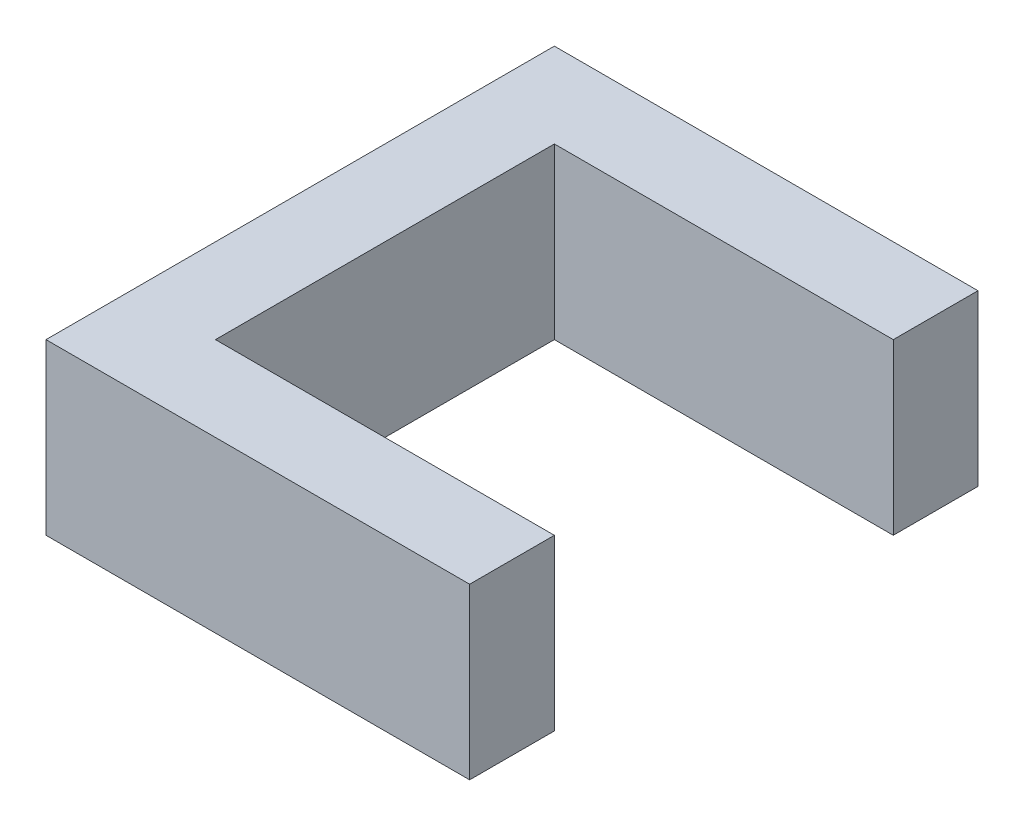
ISO-10303-21;
HEADER;
FILE_DESCRIPTION(('STEP AP214'),'2;1');
FILE_NAME('part.step','',(''),(''),'','','');
FILE_SCHEMA(('AUTOMOTIVE_DESIGN { 1 0 10303 214 1 1 1 1 }'));
ENDSEC;
DATA;
#1=APPLICATION_CONTEXT('core data for automotive mechanical design processes');
#2=APPLICATION_PROTOCOL_DEFINITION('international standard','automotive_design',2000,#1);
#3=PRODUCT_CONTEXT('',#1,'mechanical');
#4=PRODUCT('Part','Part','',(#3));
#5=PRODUCT_RELATED_PRODUCT_CATEGORY('part','',(#4));
#6=PRODUCT_DEFINITION_FORMATION('','',#4);
#7=PRODUCT_DEFINITION_CONTEXT('part definition',#1,'design');
#8=PRODUCT_DEFINITION('design','',#6,#7);
#9=PRODUCT_DEFINITION_SHAPE('','',#8);
#10=(LENGTH_UNIT() NAMED_UNIT(*) SI_UNIT(.MILLI.,.METRE.));
#11=(NAMED_UNIT(*) PLANE_ANGLE_UNIT() SI_UNIT($,.RADIAN.));
#12=(NAMED_UNIT(*) SI_UNIT($,.STERADIAN.) SOLID_ANGLE_UNIT());
#13=UNCERTAINTY_MEASURE_WITH_UNIT(LENGTH_MEASURE(1.E-05),#10,'distance_accuracy_value','');
#14=(GEOMETRIC_REPRESENTATION_CONTEXT(3) GLOBAL_UNCERTAINTY_ASSIGNED_CONTEXT((#13)) GLOBAL_UNIT_ASSIGNED_CONTEXT((#10,
#11,#12)) REPRESENTATION_CONTEXT('',''));
#15=CARTESIAN_POINT('',(0.,0.,0.));
#16=DIRECTION('',(0.,0.,1.));
#17=DIRECTION('',(1.,0.,0.));
#18=AXIS2_PLACEMENT_3D('',#15,#16,#17);
#19=CARTESIAN_POINT('',(50.,20.,0.));
#20=DIRECTION('',(0.,0.,1.));
#21=DIRECTION('',(1.,0.,0.));
#22=AXIS2_PLACEMENT_3D('',#19,#20,#21);
#23=PLANE('',#22);
#24=DIRECTION('',(-1.,0.,0.));
#25=VECTOR('',#24,1.);
#26=CARTESIAN_POINT('',(50.,0.,0.));
#27=LINE('',#26,#25);
#28=CARTESIAN_POINT('',(50.,0.,0.));
#29=VERTEX_POINT('',#28);
#30=CARTESIAN_POINT('',(0.,0.,0.));
#31=VERTEX_POINT('',#30);
#32=EDGE_CURVE('E133',#29,#31,#27,.T.);
#33=ORIENTED_EDGE('',*,*,#32,.T.);
#34=DIRECTION('',(0.,-1.,0.));
#35=VECTOR('',#34,1.);
#36=CARTESIAN_POINT('',(0.,20.,0.));
#37=LINE('',#36,#35);
#38=CARTESIAN_POINT('',(0.,20.,0.));
#39=VERTEX_POINT('',#38);
#40=EDGE_CURVE('E11',#39,#31,#37,.T.);
#41=ORIENTED_EDGE('',*,*,#40,.F.);
#42=DIRECTION('',(-1.,0.,0.));
#43=VECTOR('',#42,1.);
#44=CARTESIAN_POINT('',(50.,20.,0.));
#45=LINE('',#44,#43);
#46=CARTESIAN_POINT('',(50.,20.,0.));
#47=VERTEX_POINT('',#46);
#48=EDGE_CURVE('E147',#47,#39,#45,.T.);
#49=ORIENTED_EDGE('',*,*,#48,.F.);
#50=DIRECTION('',(0.,-1.,0.));
#51=VECTOR('',#50,1.);
#52=CARTESIAN_POINT('',(50.,20.,0.));
#53=LINE('',#52,#51);
#54=EDGE_CURVE('E129',#47,#29,#53,.T.);
#55=ORIENTED_EDGE('',*,*,#54,.T.);
#56=EDGE_LOOP('',(#33,#41,#49,#55));
#57=FACE_BOUND('',#56,.T.);
#58=ADVANCED_FACE('F37',(#57),#23,.F.);
#59=CARTESIAN_POINT('',(0.,20.,0.));
#60=DIRECTION('',(1.,0.,0.));
#61=DIRECTION('',(0.,0.,-1.));
#62=AXIS2_PLACEMENT_3D('',#59,#60,#61);
#63=PLANE('',#62);
#64=DIRECTION('',(0.,0.,1.));
#65=VECTOR('',#64,1.);
#66=CARTESIAN_POINT('',(0.,0.,0.));
#67=LINE('',#66,#65);
#68=CARTESIAN_POINT('',(0.,0.,60.));
#69=VERTEX_POINT('',#68);
#70=EDGE_CURVE('E136',#31,#69,#67,.T.);
#71=ORIENTED_EDGE('',*,*,#70,.T.);
#72=DIRECTION('',(0.,-1.,0.));
#73=VECTOR('',#72,1.);
#74=CARTESIAN_POINT('',(0.,20.,60.));
#75=LINE('',#74,#73);
#76=CARTESIAN_POINT('',(0.,20.,60.));
#77=VERTEX_POINT('',#76);
#78=EDGE_CURVE('E45',#77,#69,#75,.T.);
#79=ORIENTED_EDGE('',*,*,#78,.F.);
#80=DIRECTION('',(0.,0.,1.));
#81=VECTOR('',#80,1.);
#82=CARTESIAN_POINT('',(0.,20.,0.));
#83=LINE('',#82,#81);
#84=EDGE_CURVE('E96',#39,#77,#83,.T.);
#85=ORIENTED_EDGE('',*,*,#84,.F.);
#86=ORIENTED_EDGE('',*,*,#40,.T.);
#87=EDGE_LOOP('',(#71,#79,#85,#86));
#88=FACE_BOUND('',#87,.T.);
#89=ADVANCED_FACE('F182',(#88),#63,.F.);
#90=CARTESIAN_POINT('',(0.,20.,60.));
#91=DIRECTION('',(0.,0.,-1.));
#92=DIRECTION('',(-1.,0.,0.));
#93=AXIS2_PLACEMENT_3D('',#90,#91,#92);
#94=PLANE('',#93);
#95=DIRECTION('',(1.,0.,0.));
#96=VECTOR('',#95,1.);
#97=CARTESIAN_POINT('',(0.,0.,60.));
#98=LINE('',#97,#96);
#99=CARTESIAN_POINT('',(50.,0.,60.));
#100=VERTEX_POINT('',#99);
#101=EDGE_CURVE('E138',#69,#100,#98,.T.);
#102=ORIENTED_EDGE('',*,*,#101,.T.);
#103=DIRECTION('',(0.,-1.,0.));
#104=VECTOR('',#103,1.);
#105=CARTESIAN_POINT('',(50.,20.,60.));
#106=LINE('',#105,#104);
#107=CARTESIAN_POINT('',(50.,20.,60.));
#108=VERTEX_POINT('',#107);
#109=EDGE_CURVE('E154',#108,#100,#106,.T.);
#110=ORIENTED_EDGE('',*,*,#109,.F.);
#111=DIRECTION('',(1.,0.,0.));
#112=VECTOR('',#111,1.);
#113=CARTESIAN_POINT('',(0.,20.,60.));
#114=LINE('',#113,#112);
#115=EDGE_CURVE('E162',#77,#108,#114,.T.);
#116=ORIENTED_EDGE('',*,*,#115,.F.);
#117=ORIENTED_EDGE('',*,*,#78,.T.);
#118=EDGE_LOOP('',(#102,#110,#116,#117));
#119=FACE_BOUND('',#118,.T.);
#120=ADVANCED_FACE('F160',(#119),#94,.F.);
#121=CARTESIAN_POINT('',(50.,20.,60.));
#122=DIRECTION('',(-1.,0.,0.));
#123=DIRECTION('',(0.,0.,1.));
#124=AXIS2_PLACEMENT_3D('',#121,#122,#123);
#125=PLANE('',#124);
#126=DIRECTION('',(0.,0.,-1.));
#127=VECTOR('',#126,1.);
#128=CARTESIAN_POINT('',(50.,0.,60.));
#129=LINE('',#128,#127);
#130=CARTESIAN_POINT('',(50.,0.,50.));
#131=VERTEX_POINT('',#130);
#132=EDGE_CURVE('E140',#100,#131,#129,.T.);
#133=ORIENTED_EDGE('',*,*,#132,.T.);
#134=DIRECTION('',(0.,-1.,0.));
#135=VECTOR('',#134,1.);
#136=CARTESIAN_POINT('',(50.,20.,50.));
#137=LINE('',#136,#135);
#138=CARTESIAN_POINT('',(50.,20.,50.));
#139=VERTEX_POINT('',#138);
#140=EDGE_CURVE('E151',#139,#131,#137,.T.);
#141=ORIENTED_EDGE('',*,*,#140,.F.);
#142=DIRECTION('',(0.,0.,-1.));
#143=VECTOR('',#142,1.);
#144=CARTESIAN_POINT('',(50.,20.,60.));
#145=LINE('',#144,#143);
#146=EDGE_CURVE('E174',#108,#139,#145,.T.);
#147=ORIENTED_EDGE('',*,*,#146,.F.);
#148=ORIENTED_EDGE('',*,*,#109,.T.);
#149=EDGE_LOOP('',(#133,#141,#147,#148));
#150=FACE_BOUND('',#149,.T.);
#151=ADVANCED_FACE('F170',(#150),#125,.F.);
#152=CARTESIAN_POINT('',(50.,20.,50.));
#153=DIRECTION('',(0.,0.,1.));
#154=DIRECTION('',(1.,0.,0.));
#155=AXIS2_PLACEMENT_3D('',#152,#153,#154);
#156=PLANE('',#155);
#157=DIRECTION('',(-1.,0.,0.));
#158=VECTOR('',#157,1.);
#159=CARTESIAN_POINT('',(50.,0.,50.));
#160=LINE('',#159,#158);
#161=CARTESIAN_POINT('',(10.,0.,50.));
#162=VERTEX_POINT('',#161);
#163=EDGE_CURVE('E142',#131,#162,#160,.T.);
#164=ORIENTED_EDGE('',*,*,#163,.T.);
#165=DIRECTION('',(0.,-1.,0.));
#166=VECTOR('',#165,1.);
#167=CARTESIAN_POINT('',(10.,20.,50.));
#168=LINE('',#167,#166);
#169=CARTESIAN_POINT('',(10.,20.,50.));
#170=VERTEX_POINT('',#169);
#171=EDGE_CURVE('E124',#170,#162,#168,.T.);
#172=ORIENTED_EDGE('',*,*,#171,.F.);
#173=DIRECTION('',(-1.,0.,0.));
#174=VECTOR('',#173,1.);
#175=CARTESIAN_POINT('',(50.,20.,50.));
#176=LINE('',#175,#174);
#177=EDGE_CURVE('E115',#139,#170,#176,.T.);
#178=ORIENTED_EDGE('',*,*,#177,.F.);
#179=ORIENTED_EDGE('',*,*,#140,.T.);
#180=EDGE_LOOP('',(#164,#172,#178,#179));
#181=FACE_BOUND('',#180,.T.);
#182=ADVANCED_FACE('F173',(#181),#156,.F.);
#183=CARTESIAN_POINT('',(10.,20.,50.));
#184=DIRECTION('',(-1.,0.,0.));
#185=DIRECTION('',(0.,0.,1.));
#186=AXIS2_PLACEMENT_3D('',#183,#184,#185);
#187=PLANE('',#186);
#188=DIRECTION('',(0.,0.,-1.));
#189=VECTOR('',#188,1.);
#190=CARTESIAN_POINT('',(10.,0.,50.));
#191=LINE('',#190,#189);
#192=CARTESIAN_POINT('',(10.,0.,10.));
#193=VERTEX_POINT('',#192);
#194=EDGE_CURVE('E123',#162,#193,#191,.T.);
#195=ORIENTED_EDGE('',*,*,#194,.T.);
#196=DIRECTION('',(0.,-1.,0.));
#197=VECTOR('',#196,1.);
#198=CARTESIAN_POINT('',(10.,20.,10.));
#199=LINE('',#198,#197);
#200=CARTESIAN_POINT('',(10.,20.,10.));
#201=VERTEX_POINT('',#200);
#202=EDGE_CURVE('E120',#201,#193,#199,.T.);
#203=ORIENTED_EDGE('',*,*,#202,.F.);
#204=DIRECTION('',(0.,0.,-1.));
#205=VECTOR('',#204,1.);
#206=CARTESIAN_POINT('',(10.,20.,50.));
#207=LINE('',#206,#205);
#208=EDGE_CURVE('E109',#170,#201,#207,.T.);
#209=ORIENTED_EDGE('',*,*,#208,.F.);
#210=ORIENTED_EDGE('',*,*,#171,.T.);
#211=EDGE_LOOP('',(#195,#203,#209,#210));
#212=FACE_BOUND('',#211,.T.);
#213=ADVANCED_FACE('F121',(#212),#187,.F.);
#214=CARTESIAN_POINT('',(10.,20.,10.));
#215=DIRECTION('',(0.,0.,-1.));
#216=DIRECTION('',(-1.,0.,0.));
#217=AXIS2_PLACEMENT_3D('',#214,#215,#216);
#218=PLANE('',#217);
#219=DIRECTION('',(1.,0.,0.));
#220=VECTOR('',#219,1.);
#221=CARTESIAN_POINT('',(10.,0.,10.));
#222=LINE('',#221,#220);
#223=CARTESIAN_POINT('',(50.,0.,10.));
#224=VERTEX_POINT('',#223);
#225=EDGE_CURVE('E82',#193,#224,#222,.T.);
#226=ORIENTED_EDGE('',*,*,#225,.T.);
#227=DIRECTION('',(0.,-1.,0.));
#228=VECTOR('',#227,1.);
#229=CARTESIAN_POINT('',(50.,20.,10.));
#230=LINE('',#229,#228);
#231=CARTESIAN_POINT('',(50.,20.,10.));
#232=VERTEX_POINT('',#231);
#233=EDGE_CURVE('E125',#232,#224,#230,.T.);
#234=ORIENTED_EDGE('',*,*,#233,.F.);
#235=DIRECTION('',(1.,0.,0.));
#236=VECTOR('',#235,1.);
#237=CARTESIAN_POINT('',(10.,20.,10.));
#238=LINE('',#237,#236);
#239=EDGE_CURVE('E113',#201,#232,#238,.T.);
#240=ORIENTED_EDGE('',*,*,#239,.F.);
#241=ORIENTED_EDGE('',*,*,#202,.T.);
#242=EDGE_LOOP('',(#226,#234,#240,#241));
#243=FACE_BOUND('',#242,.T.);
#244=ADVANCED_FACE('F127',(#243),#218,.F.);
#245=CARTESIAN_POINT('',(50.,20.,10.));
#246=DIRECTION('',(-1.,0.,0.));
#247=DIRECTION('',(0.,0.,1.));
#248=AXIS2_PLACEMENT_3D('',#245,#246,#247);
#249=PLANE('',#248);
#250=DIRECTION('',(0.,0.,-1.));
#251=VECTOR('',#250,1.);
#252=CARTESIAN_POINT('',(50.,0.,10.));
#253=LINE('',#252,#251);
#254=EDGE_CURVE('E88',#224,#29,#253,.T.);
#255=ORIENTED_EDGE('',*,*,#254,.T.);
#256=ORIENTED_EDGE('',*,*,#54,.F.);
#257=DIRECTION('',(0.,0.,-1.));
#258=VECTOR('',#257,1.);
#259=CARTESIAN_POINT('',(50.,20.,10.));
#260=LINE('',#259,#258);
#261=EDGE_CURVE('E53',#232,#47,#260,.T.);
#262=ORIENTED_EDGE('',*,*,#261,.F.);
#263=ORIENTED_EDGE('',*,*,#233,.T.);
#264=EDGE_LOOP('',(#255,#256,#262,#263));
#265=FACE_BOUND('',#264,.T.);
#266=ADVANCED_FACE('F198',(#265),#249,.F.);
#267=CARTESIAN_POINT('',(0.,20.,0.));
#268=DIRECTION('',(0.,1.,0.));
#269=DIRECTION('',(0.,0.,1.));
#270=AXIS2_PLACEMENT_3D('',#267,#268,#269);
#271=PLANE('',#270);
#272=ORIENTED_EDGE('',*,*,#48,.T.);
#273=ORIENTED_EDGE('',*,*,#84,.T.);
#274=ORIENTED_EDGE('',*,*,#115,.T.);
#275=ORIENTED_EDGE('',*,*,#146,.T.);
#276=ORIENTED_EDGE('',*,*,#177,.T.);
#277=ORIENTED_EDGE('',*,*,#208,.T.);
#278=ORIENTED_EDGE('',*,*,#239,.T.);
#279=ORIENTED_EDGE('',*,*,#261,.T.);
#280=EDGE_LOOP('',(#272,#273,#274,#275,#276,#277,#278,#279));
#281=FACE_BOUND('',#280,.T.);
#282=ADVANCED_FACE('F111',(#281),#271,.T.);
#283=CARTESIAN_POINT('',(0.,0.,0.));
#284=DIRECTION('',(0.,1.,0.));
#285=DIRECTION('',(0.,0.,1.));
#286=AXIS2_PLACEMENT_3D('',#283,#284,#285);
#287=PLANE('',#286);
#288=ORIENTED_EDGE('',*,*,#32,.F.);
#289=ORIENTED_EDGE('',*,*,#254,.F.);
#290=ORIENTED_EDGE('',*,*,#225,.F.);
#291=ORIENTED_EDGE('',*,*,#194,.F.);
#292=ORIENTED_EDGE('',*,*,#163,.F.);
#293=ORIENTED_EDGE('',*,*,#132,.F.);
#294=ORIENTED_EDGE('',*,*,#101,.F.);
#295=ORIENTED_EDGE('',*,*,#70,.F.);
#296=EDGE_LOOP('',(#288,#289,#290,#291,#292,#293,#294,#295));
#297=FACE_BOUND('',#296,.T.);
#298=ADVANCED_FACE('F166',(#297),#287,.F.);
#299=CLOSED_SHELL('',(#58,#89,#120,#151,#182,#213,#244,#266,#282,#298));
#300=MANIFOLD_SOLID_BREP('B2',#299);
#301=ADVANCED_BREP_SHAPE_REPRESENTATION('',(#18,#300),#14);
#302=SHAPE_DEFINITION_REPRESENTATION(#9,#301);
ENDSEC;
END-ISO-10303-21;
